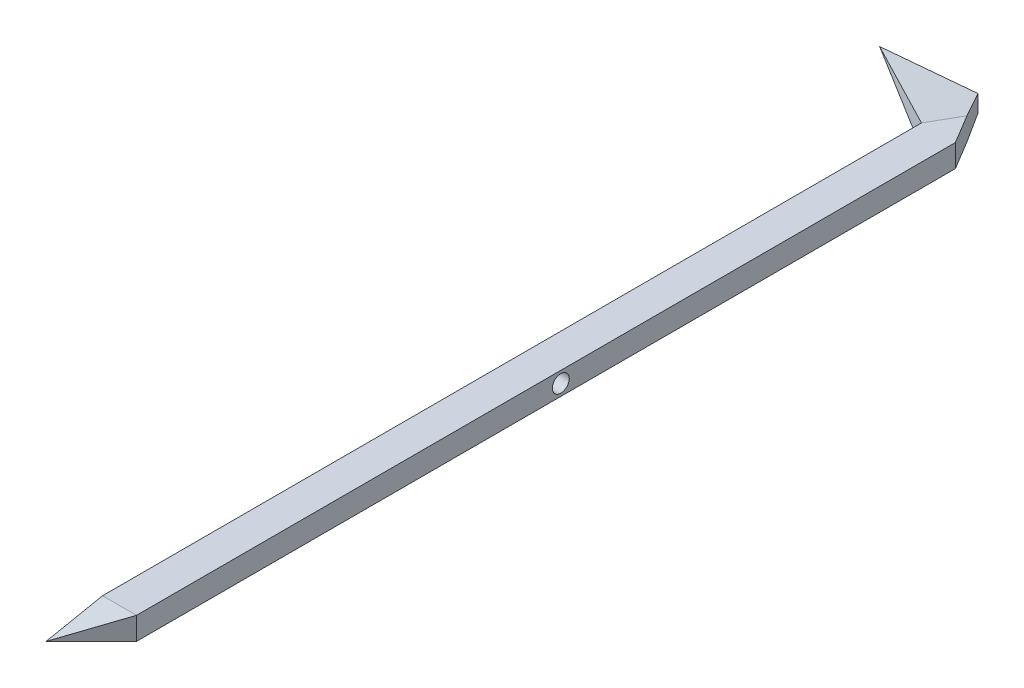
ISO-10303-21;
HEADER;
FILE_DESCRIPTION(('STEP AP214'),'2;1');
FILE_NAME('part.step','',(''),(''),'','','');
FILE_SCHEMA(('AUTOMOTIVE_DESIGN { 1 0 10303 214 1 1 1 1 }'));
ENDSEC;
DATA;
#1=APPLICATION_CONTEXT('core data for automotive mechanical design processes');
#2=APPLICATION_PROTOCOL_DEFINITION('international standard','automotive_design',2000,#1);
#3=PRODUCT_CONTEXT('',#1,'mechanical');
#4=PRODUCT('Part','Part','',(#3));
#5=PRODUCT_RELATED_PRODUCT_CATEGORY('part','',(#4));
#6=PRODUCT_DEFINITION_FORMATION('','',#4);
#7=PRODUCT_DEFINITION_CONTEXT('part definition',#1,'design');
#8=PRODUCT_DEFINITION('design','',#6,#7);
#9=PRODUCT_DEFINITION_SHAPE('','',#8);
#10=(LENGTH_UNIT() NAMED_UNIT(*) SI_UNIT(.MILLI.,.METRE.));
#11=(NAMED_UNIT(*) PLANE_ANGLE_UNIT() SI_UNIT($,.RADIAN.));
#12=(NAMED_UNIT(*) SI_UNIT($,.STERADIAN.) SOLID_ANGLE_UNIT());
#13=UNCERTAINTY_MEASURE_WITH_UNIT(LENGTH_MEASURE(1.E-05),#10,'distance_accuracy_value','');
#14=(GEOMETRIC_REPRESENTATION_CONTEXT(3) GLOBAL_UNCERTAINTY_ASSIGNED_CONTEXT((#13)) GLOBAL_UNIT_ASSIGNED_CONTEXT((#10,
#11,#12)) REPRESENTATION_CONTEXT('',''));
#15=CARTESIAN_POINT('',(0.,0.,0.));
#16=DIRECTION('',(0.,0.,1.));
#17=DIRECTION('',(1.,0.,0.));
#18=AXIS2_PLACEMENT_3D('',#15,#16,#17);
#19=CARTESIAN_POINT('',(46.1850441176472,5.08,-27.7110264705885));
#20=DIRECTION('',(-0.857492925712542,0.,0.514495755427529));
#21=DIRECTION('',(0.51449575542753,0.,0.857492925712543));
#22=AXIS2_PLACEMENT_3D('',#19,#20,#21);
#23=PLANE('',#22);
#24=DIRECTION('',(0.512558070553615,-0.0867074433253538,0.854263450922686));
#25=VECTOR('',#24,1.);
#26=CARTESIAN_POINT('',(45.6400758618361,-7.09010453384916,-28.6193068969404));
#27=LINE('',#26,#25);
#28=CARTESIAN_POINT('',(0.,0.630648525176283,-104.6861));
#29=VERTEX_POINT('',#28);
#30=CARTESIAN_POINT('',(3.72798434442267,0.,-98.4727927592955));
#31=VERTEX_POINT('',#30);
#32=EDGE_CURVE('E134',#29,#31,#27,.T.);
#33=ORIENTED_EDGE('',*,*,#32,.F.);
#34=DIRECTION('',(0.,-1.,0.));
#35=VECTOR('',#34,1.);
#36=CARTESIAN_POINT('',(0.,5.08,-104.6861));
#37=LINE('',#36,#35);
#38=CARTESIAN_POINT('',(0.,4.44935147482372,-104.6861));
#39=VERTEX_POINT('',#38);
#40=EDGE_CURVE('E194',#39,#29,#37,.T.);
#41=ORIENTED_EDGE('',*,*,#40,.F.);
#42=DIRECTION('',(-0.512558070553615,-0.0867074433253538,-0.854263450922686));
#43=VECTOR('',#42,1.);
#44=CARTESIAN_POINT('',(45.8658442690918,12.2082968919475,-28.2430262181809));
#45=LINE('',#44,#43);
#46=CARTESIAN_POINT('',(3.72798434442267,5.08,-98.4727927592955));
#47=VERTEX_POINT('',#46);
#48=EDGE_CURVE('E202',#47,#39,#45,.T.);
#49=ORIENTED_EDGE('',*,*,#48,.F.);
#50=DIRECTION('',(-0.514495755427529,0.,-0.857492925712542));
#51=VECTOR('',#50,1.);
#52=CARTESIAN_POINT('',(46.1850441176472,5.08,-27.7110264705885));
#53=LINE('',#52,#51);
#54=CARTESIAN_POINT('',(7.62000000000002,5.08,-91.9861));
#55=VERTEX_POINT('',#54);
#56=EDGE_CURVE('E239',#55,#47,#53,.T.);
#57=ORIENTED_EDGE('',*,*,#56,.F.);
#58=DIRECTION('',(0.,-1.,0.));
#59=VECTOR('',#58,1.);
#60=CARTESIAN_POINT('',(7.62000000000002,5.08,-91.9861));
#61=LINE('',#60,#59);
#62=CARTESIAN_POINT('',(7.62000000000002,0.,-91.9861));
#63=VERTEX_POINT('',#62);
#64=EDGE_CURVE('E261',#55,#63,#61,.T.);
#65=ORIENTED_EDGE('',*,*,#64,.T.);
#66=DIRECTION('',(-0.514495755427529,0.,-0.857492925712542));
#67=VECTOR('',#66,1.);
#68=CARTESIAN_POINT('',(46.1850441176472,0.,-27.7110264705885));
#69=LINE('',#68,#67);
#70=EDGE_CURVE('E249',#63,#31,#69,.T.);
#71=ORIENTED_EDGE('',*,*,#70,.T.);
#72=EDGE_LOOP('',(#33,#41,#49,#57,#65,#71));
#73=FACE_BOUND('',#72,.T.);
#74=ADVANCED_FACE('F119',(#73),#23,.F.);
#75=CARTESIAN_POINT('',(0.,5.08,-104.6861));
#76=DIRECTION('',(0.,0.,1.));
#77=DIRECTION('',(1.,0.,0.));
#78=AXIS2_PLACEMENT_3D('',#75,#76,#77);
#79=PLANE('',#78);
#80=DIRECTION('',(0.996287962103121,-0.0860830794547339,0.));
#81=VECTOR('',#80,1.);
#82=CARTESIAN_POINT('',(-0.38159211450458,0.663619539141816,-104.6861));
#83=LINE('',#82,#81);
#84=CARTESIAN_POINT('',(-22.098,2.54,-104.6861));
#85=VERTEX_POINT('',#84);
#86=EDGE_CURVE('E179',#85,#29,#83,.T.);
#87=ORIENTED_EDGE('',*,*,#86,.F.);
#88=DIRECTION('',(-0.996287962103121,-0.0860830794547339,0.));
#89=VECTOR('',#88,1.);
#90=CARTESIAN_POINT('',(0.0540866473671303,4.45402476742571,-104.6861));
#91=LINE('',#90,#89);
#92=EDGE_CURVE('E192',#39,#85,#91,.T.);
#93=ORIENTED_EDGE('',*,*,#92,.F.);
#94=ORIENTED_EDGE('',*,*,#40,.T.);
#95=EDGE_LOOP('',(#87,#93,#94));
#96=FACE_BOUND('',#95,.T.);
#97=ADVANCED_FACE('F191',(#96),#79,.F.);
#98=CARTESIAN_POINT('',(39.7397492303108,5.08,-69.1471636607409));
#99=DIRECTION('',(0.498283875853458,0.,-0.867013943985018));
#100=DIRECTION('',(-0.867013943985018,0.,-0.498283875853458));
#101=AXIS2_PLACEMENT_3D('',#98,#99,#100);
#102=PLANE('',#101);
#103=DIRECTION('',(-0.862740387088617,0.0991655617343237,-0.495827808671618));
#104=VECTOR('',#103,1.);
#105=CARTESIAN_POINT('',(38.9143411348215,-4.47291277411741,-69.621536129413));
#106=LINE('',#105,#104);
#107=CARTESIAN_POINT('',(0.,0.,-91.9861));
#108=VERTEX_POINT('',#107);
#109=EDGE_CURVE('E176',#108,#85,#106,.T.);
#110=ORIENTED_EDGE('',*,*,#109,.F.);
#111=DIRECTION('',(0.,-1.,0.));
#112=VECTOR('',#111,1.);
#113=CARTESIAN_POINT('',(0.,5.08,-91.9861));
#114=LINE('',#113,#112);
#115=CARTESIAN_POINT('',(0.,5.08,-91.9861));
#116=VERTEX_POINT('',#115);
#117=EDGE_CURVE('E206',#116,#108,#114,.T.);
#118=ORIENTED_EDGE('',*,*,#117,.F.);
#119=DIRECTION('',(0.862740387088617,0.0991655617343237,0.495827808671618));
#120=VECTOR('',#119,1.);
#121=CARTESIAN_POINT('',(39.3489561412135,9.60286852197856,-69.3717573901072));
#122=LINE('',#121,#120);
#123=EDGE_CURVE('E199',#85,#116,#122,.T.);
#124=ORIENTED_EDGE('',*,*,#123,.F.);
#125=EDGE_LOOP('',(#110,#118,#124));
#126=FACE_BOUND('',#125,.T.);
#127=ADVANCED_FACE('F205',(#126),#102,.F.);
#128=CARTESIAN_POINT('',(0.,0.,0.));
#129=DIRECTION('',(0.,1.,0.));
#130=DIRECTION('',(0.,0.,1.));
#131=AXIS2_PLACEMENT_3D('',#128,#129,#130);
#132=PLANE('',#131);
#133=DIRECTION('',(-0.498283875853458,0.,0.867013943985018));
#134=VECTOR('',#133,1.);
#135=CARTESIAN_POINT('',(-39.7397492303108,0.,-22.8389363392591));
#136=LINE('',#135,#134);
#137=EDGE_CURVE('E12',#31,#108,#136,.T.);
#138=ORIENTED_EDGE('',*,*,#137,.F.);
#139=ORIENTED_EDGE('',*,*,#70,.F.);
#140=DIRECTION('',(0.,0.,-1.));
#141=VECTOR('',#140,1.);
#142=CARTESIAN_POINT('',(7.62000000000002,0.,0.));
#143=LINE('',#142,#141);
#144=CARTESIAN_POINT('',(7.62000600000002,0.,91.9861));
#145=VERTEX_POINT('',#144);
#146=EDGE_CURVE('E238',#145,#63,#143,.T.);
#147=ORIENTED_EDGE('',*,*,#146,.F.);
#148=DIRECTION('',(1.,0.,0.));
#149=VECTOR('',#148,1.);
#150=CARTESIAN_POINT('',(-22.098,0.,91.9861));
#151=LINE('',#150,#149);
#152=CARTESIAN_POINT('',(0.,0.,91.9861));
#153=VERTEX_POINT('',#152);
#154=EDGE_CURVE('E215',#153,#145,#151,.T.);
#155=ORIENTED_EDGE('',*,*,#154,.F.);
#156=DIRECTION('',(0.,0.,1.));
#157=VECTOR('',#156,1.);
#158=CARTESIAN_POINT('',(0.,0.,0.));
#159=LINE('',#158,#157);
#160=EDGE_CURVE('E253',#108,#153,#159,.T.);
#161=ORIENTED_EDGE('',*,*,#160,.F.);
#162=EDGE_LOOP('',(#138,#139,#147,#155,#161));
#163=FACE_BOUND('',#162,.T.);
#164=ADVANCED_FACE('F292',(#163),#132,.F.);
#165=CARTESIAN_POINT('',(0.,5.08,0.));
#166=DIRECTION('',(0.,1.,0.));
#167=DIRECTION('',(0.,0.,1.));
#168=AXIS2_PLACEMENT_3D('',#165,#166,#167);
#169=PLANE('',#168);
#170=ORIENTED_EDGE('',*,*,#56,.T.);
#171=DIRECTION('',(-0.498283875853458,0.,0.867013943985018));
#172=VECTOR('',#171,1.);
#173=CARTESIAN_POINT('',(-39.7397492303108,5.08,-22.8389363392591));
#174=LINE('',#173,#172);
#175=EDGE_CURVE('E128',#47,#116,#174,.T.);
#176=ORIENTED_EDGE('',*,*,#175,.T.);
#177=DIRECTION('',(0.,0.,1.));
#178=VECTOR('',#177,1.);
#179=CARTESIAN_POINT('',(0.,5.08,0.));
#180=LINE('',#179,#178);
#181=CARTESIAN_POINT('',(0.,5.08,91.9861));
#182=VERTEX_POINT('',#181);
#183=EDGE_CURVE('E243',#116,#182,#180,.T.);
#184=ORIENTED_EDGE('',*,*,#183,.T.);
#185=DIRECTION('',(-1.,0.,0.));
#186=VECTOR('',#185,1.);
#187=CARTESIAN_POINT('',(0.,5.08,91.9861));
#188=LINE('',#187,#186);
#189=CARTESIAN_POINT('',(7.62000000000002,5.08,91.9861));
#190=VERTEX_POINT('',#189);
#191=EDGE_CURVE('E265',#190,#182,#188,.T.);
#192=ORIENTED_EDGE('',*,*,#191,.F.);
#193=DIRECTION('',(0.,0.,-1.));
#194=VECTOR('',#193,1.);
#195=CARTESIAN_POINT('',(7.62000000000002,5.08,0.));
#196=LINE('',#195,#194);
#197=EDGE_CURVE('E244',#190,#55,#196,.T.);
#198=ORIENTED_EDGE('',*,*,#197,.T.);
#199=EDGE_LOOP('',(#170,#176,#184,#192,#198));
#200=FACE_BOUND('',#199,.T.);
#201=ADVANCED_FACE('F286',(#200),#169,.T.);
#202=CARTESIAN_POINT('',(7.62000000000002,5.08,0.));
#203=DIRECTION('',(-1.,0.,0.));
#204=DIRECTION('',(0.,0.,1.));
#205=AXIS2_PLACEMENT_3D('',#202,#203,#204);
#206=PLANE('',#205);
#207=CARTESIAN_POINT('',(7.62000000000002,2.54,-3.3401));
#208=DIRECTION('',(-1.,0.,0.));
#209=DIRECTION('',(0.,0.,1.));
#210=AXIS2_PLACEMENT_3D('',#207,#208,#209);
#211=CIRCLE('',#210,1.905);
#212=CARTESIAN_POINT('',(7.62000000000002,2.54,-1.4351));
#213=VERTEX_POINT('',#212);
#214=EDGE_CURVE('E185',#213,#213,#211,.T.);
#215=ORIENTED_EDGE('',*,*,#214,.T.);
#216=EDGE_LOOP('',(#215));
#217=FACE_BOUND('',#216,.T.);
#218=ORIENTED_EDGE('',*,*,#146,.T.);
#219=ORIENTED_EDGE('',*,*,#64,.F.);
#220=ORIENTED_EDGE('',*,*,#197,.F.);
#221=DIRECTION('',(0.,-1.,0.));
#222=VECTOR('',#221,1.);
#223=CARTESIAN_POINT('',(7.62000000000002,5.08,91.9861));
#224=LINE('',#223,#222);
#225=EDGE_CURVE('E248',#190,#145,#224,.T.);
#226=ORIENTED_EDGE('',*,*,#225,.T.);
#227=EDGE_LOOP('',(#218,#219,#220,#226));
#228=FACE_BOUND('',#227,.T.);
#229=ADVANCED_FACE('F121',(#217,#228),#206,.F.);
#230=CARTESIAN_POINT('',(0.,5.08,0.));
#231=DIRECTION('',(1.,0.,0.));
#232=DIRECTION('',(0.,0.,-1.));
#233=AXIS2_PLACEMENT_3D('',#230,#231,#232);
#234=PLANE('',#233);
#235=CARTESIAN_POINT('',(0.,2.54,-3.3401));
#236=DIRECTION('',(-1.,0.,0.));
#237=DIRECTION('',(0.,0.,1.));
#238=AXIS2_PLACEMENT_3D('',#235,#236,#237);
#239=CIRCLE('',#238,1.905);
#240=CARTESIAN_POINT('',(0.,2.54,-1.4351));
#241=VERTEX_POINT('',#240);
#242=EDGE_CURVE('E343',#241,#241,#239,.T.);
#243=ORIENTED_EDGE('',*,*,#242,.F.);
#244=EDGE_LOOP('',(#243));
#245=FACE_BOUND('',#244,.T.);
#246=ORIENTED_EDGE('',*,*,#160,.T.);
#247=DIRECTION('',(0.,0.196116135138184,0.98058067569092));
#248=VECTOR('',#247,1.);
#249=CARTESIAN_POINT('',(0.,-17.49425,4.51485000000001));
#250=LINE('',#249,#248);
#251=CARTESIAN_POINT('',(0.,2.54,104.6861));
#252=VERTEX_POINT('',#251);
#253=EDGE_CURVE('E142',#153,#252,#250,.T.);
#254=ORIENTED_EDGE('',*,*,#253,.T.);
#255=DIRECTION('',(0.,0.196116135138184,-0.98058067569092));
#256=VECTOR('',#255,1.);
#257=CARTESIAN_POINT('',(0.,22.7696346153846,3.53792692307693));
#258=LINE('',#257,#256);
#259=EDGE_CURVE('E232',#252,#182,#258,.T.);
#260=ORIENTED_EDGE('',*,*,#259,.T.);
#261=ORIENTED_EDGE('',*,*,#183,.F.);
#262=ORIENTED_EDGE('',*,*,#117,.T.);
#263=EDGE_LOOP('',(#246,#254,#260,#261,#262));
#264=FACE_BOUND('',#263,.T.);
#265=ADVANCED_FACE('F295',(#245,#264),#234,.F.);
#266=CARTESIAN_POINT('',(46.1850441176471,5.08,27.7110264705882));
#267=DIRECTION('',(-0.857492925712544,0.,-0.514495755427526));
#268=DIRECTION('',(-0.514495755427526,0.,0.857492925712544));
#269=AXIS2_PLACEMENT_3D('',#266,#267,#268);
#270=PLANE('',#269);
#271=DIRECTION('',(-0.50709255283711,-0.169030850945703,0.845154254728517));
#272=VECTOR('',#271,1.);
#273=CARTESIAN_POINT('',(45.0831857142857,17.5677285714286,29.5474571428571));
#274=LINE('',#273,#272);
#275=EDGE_CURVE('E228',#190,#252,#274,.T.);
#276=ORIENTED_EDGE('',*,*,#275,.T.);
#277=DIRECTION('',(0.50709255283711,-0.169030850945703,-0.845154254728517));
#278=VECTOR('',#277,1.);
#279=CARTESIAN_POINT('',(44.6477571428571,-12.3425857142857,30.2731714285714));
#280=LINE('',#279,#278);
#281=EDGE_CURVE('E220',#252,#145,#280,.T.);
#282=ORIENTED_EDGE('',*,*,#281,.T.);
#283=ORIENTED_EDGE('',*,*,#225,.F.);
#284=EDGE_LOOP('',(#276,#282,#283));
#285=FACE_BOUND('',#284,.T.);
#286=ADVANCED_FACE('F301',(#285),#270,.F.);
#287=CARTESIAN_POINT('',(7.62001200000002,22.57425,4.51485000000001));
#288=DIRECTION('',(0.,-0.98058067569092,-0.196116135138184));
#289=DIRECTION('',(0.,0.196116135138184,-0.98058067569092));
#290=AXIS2_PLACEMENT_3D('',#287,#288,#289);
#291=PLANE('',#290);
#292=ORIENTED_EDGE('',*,*,#275,.F.);
#293=ORIENTED_EDGE('',*,*,#191,.T.);
#294=ORIENTED_EDGE('',*,*,#259,.F.);
#295=EDGE_LOOP('',(#292,#293,#294));
#296=FACE_BOUND('',#295,.T.);
#297=ADVANCED_FACE('F298',(#296),#291,.F.);
#298=CARTESIAN_POINT('',(7.62001200000002,-17.6896346153846,3.53792692307693));
#299=DIRECTION('',(0.,0.98058067569092,-0.196116135138184));
#300=DIRECTION('',(0.,0.196116135138184,0.98058067569092));
#301=AXIS2_PLACEMENT_3D('',#298,#299,#300);
#302=PLANE('',#301);
#303=ORIENTED_EDGE('',*,*,#154,.T.);
#304=ORIENTED_EDGE('',*,*,#281,.F.);
#305=ORIENTED_EDGE('',*,*,#253,.F.);
#306=EDGE_LOOP('',(#303,#304,#305));
#307=FACE_BOUND('',#306,.T.);
#308=ADVANCED_FACE('F330',(#307),#302,.F.);
#309=CARTESIAN_POINT('',(46.2929440248801,9.55291277411741,-82.460305158115));
#310=DIRECTION('',(-0.0859779247867658,0.995070947905684,-0.0494126004521642));
#311=DIRECTION('',(-0.996287962103121,-0.0860830794547339,0.));
#312=AXIS2_PLACEMENT_3D('',#309,#310,#311);
#313=PLANE('',#312);
#314=ORIENTED_EDGE('',*,*,#48,.T.);
#315=ORIENTED_EDGE('',*,*,#92,.T.);
#316=ORIENTED_EDGE('',*,*,#123,.T.);
#317=ORIENTED_EDGE('',*,*,#175,.F.);
#318=EDGE_LOOP('',(#314,#315,#316,#317));
#319=FACE_BOUND('',#318,.T.);
#320=ADVANCED_FACE('F198',(#319),#313,.T.);
#321=CARTESIAN_POINT('',(46.7275590312721,-4.52286852197856,-82.2105264188092));
#322=DIRECTION('',(-0.0859779247867658,-0.995070947905684,-0.0494126004521642));
#323=DIRECTION('',(0.996287962103121,-0.0860830794547339,0.));
#324=AXIS2_PLACEMENT_3D('',#321,#322,#323);
#325=PLANE('',#324);
#326=ORIENTED_EDGE('',*,*,#32,.T.);
#327=ORIENTED_EDGE('',*,*,#137,.T.);
#328=ORIENTED_EDGE('',*,*,#109,.T.);
#329=ORIENTED_EDGE('',*,*,#86,.T.);
#330=EDGE_LOOP('',(#326,#327,#328,#329));
#331=FACE_BOUND('',#330,.T.);
#332=ADVANCED_FACE('F178',(#331),#325,.T.);
#333=CARTESIAN_POINT('',(21.336,2.54,-3.3401));
#334=DIRECTION('',(-1.,0.,0.));
#335=DIRECTION('',(0.,0.,1.));
#336=AXIS2_PLACEMENT_3D('',#333,#334,#335);
#337=CYLINDRICAL_SURFACE('',#336,1.905);
#338=CARTESIAN_POINT('',(0.,2.54,-1.4351));
#339=CARTESIAN_POINT('',(0.0793750000000007,2.54,-1.4351));
#340=CARTESIAN_POINT('',(0.158750000000002,2.54,-1.4351));
#341=CARTESIAN_POINT('',(0.317500000000002,2.54,-1.4351));
#342=CARTESIAN_POINT('',(0.396875000000001,2.54,-1.4351));
#343=CARTESIAN_POINT('',(0.555625000000002,2.54,-1.4351));
#344=CARTESIAN_POINT('',(0.635000000000002,2.54,-1.4351));
#345=CARTESIAN_POINT('',(0.793750000000003,2.54,-1.4351));
#346=CARTESIAN_POINT('',(0.873125000000002,2.54,-1.4351));
#347=CARTESIAN_POINT('',(1.031875,2.54,-1.4351));
#348=CARTESIAN_POINT('',(1.11125,2.54,-1.4351));
#349=CARTESIAN_POINT('',(1.27,2.54,-1.4351));
#350=CARTESIAN_POINT('',(1.34937500000001,2.54,-1.4351));
#351=CARTESIAN_POINT('',(1.50812500000001,2.54,-1.4351));
#352=CARTESIAN_POINT('',(1.58750000000001,2.54,-1.4351));
#353=CARTESIAN_POINT('',(1.74625000000001,2.54,-1.4351));
#354=CARTESIAN_POINT('',(1.82562500000001,2.54,-1.4351));
#355=CARTESIAN_POINT('',(1.98437500000001,2.54,-1.4351));
#356=CARTESIAN_POINT('',(2.06375000000001,2.54,-1.4351));
#357=CARTESIAN_POINT('',(2.22250000000001,2.54,-1.4351));
#358=CARTESIAN_POINT('',(2.30187500000001,2.54,-1.4351));
#359=CARTESIAN_POINT('',(2.46062500000001,2.54,-1.4351));
#360=CARTESIAN_POINT('',(2.54000000000001,2.54,-1.4351));
#361=CARTESIAN_POINT('',(2.69875000000001,2.54,-1.4351));
#362=CARTESIAN_POINT('',(2.77812500000001,2.54,-1.4351));
#363=CARTESIAN_POINT('',(2.93687500000001,2.54,-1.4351));
#364=CARTESIAN_POINT('',(3.01625000000001,2.54,-1.4351));
#365=CARTESIAN_POINT('',(3.17500000000001,2.54,-1.4351));
#366=CARTESIAN_POINT('',(3.25437500000001,2.54,-1.4351));
#367=CARTESIAN_POINT('',(3.41312500000001,2.54,-1.4351));
#368=CARTESIAN_POINT('',(3.49250000000001,2.54,-1.4351));
#369=CARTESIAN_POINT('',(3.65125000000001,2.54,-1.4351));
#370=CARTESIAN_POINT('',(3.73062500000001,2.54,-1.4351));
#371=CARTESIAN_POINT('',(3.88937500000001,2.54,-1.4351));
#372=CARTESIAN_POINT('',(3.96875000000001,2.54,-1.4351));
#373=CARTESIAN_POINT('',(4.12750000000001,2.54,-1.4351));
#374=CARTESIAN_POINT('',(4.20687500000002,2.54,-1.4351));
#375=CARTESIAN_POINT('',(4.36562500000002,2.54,-1.4351));
#376=CARTESIAN_POINT('',(4.44500000000001,2.54,-1.4351));
#377=CARTESIAN_POINT('',(4.60375000000001,2.54,-1.4351));
#378=CARTESIAN_POINT('',(4.68312500000002,2.54,-1.4351));
#379=CARTESIAN_POINT('',(4.84187500000002,2.54,-1.4351));
#380=CARTESIAN_POINT('',(4.92125000000002,2.54,-1.4351));
#381=CARTESIAN_POINT('',(5.08000000000002,2.54,-1.4351));
#382=CARTESIAN_POINT('',(5.15937500000002,2.54,-1.4351));
#383=CARTESIAN_POINT('',(5.31812500000002,2.54,-1.4351));
#384=CARTESIAN_POINT('',(5.39750000000002,2.54,-1.4351));
#385=CARTESIAN_POINT('',(5.55625000000002,2.54,-1.4351));
#386=CARTESIAN_POINT('',(5.63562500000002,2.54,-1.4351));
#387=CARTESIAN_POINT('',(5.79437500000002,2.54,-1.4351));
#388=CARTESIAN_POINT('',(5.87375000000002,2.54,-1.4351));
#389=CARTESIAN_POINT('',(6.03250000000002,2.54,-1.4351));
#390=CARTESIAN_POINT('',(6.11187500000002,2.54,-1.4351));
#391=CARTESIAN_POINT('',(6.27062500000002,2.54,-1.4351));
#392=CARTESIAN_POINT('',(6.35000000000002,2.54,-1.4351));
#393=CARTESIAN_POINT('',(6.50875000000002,2.54,-1.4351));
#394=CARTESIAN_POINT('',(6.58812500000002,2.54,-1.4351));
#395=CARTESIAN_POINT('',(6.74687500000002,2.54,-1.4351));
#396=CARTESIAN_POINT('',(6.82625000000002,2.54,-1.4351));
#397=CARTESIAN_POINT('',(6.98500000000002,2.54,-1.4351));
#398=CARTESIAN_POINT('',(7.06437500000002,2.54,-1.4351));
#399=CARTESIAN_POINT('',(7.22312500000002,2.54,-1.4351));
#400=CARTESIAN_POINT('',(7.30250000000002,2.54,-1.4351));
#401=CARTESIAN_POINT('',(7.46125000000002,2.54,-1.4351));
#402=CARTESIAN_POINT('',(7.54062500000002,2.54,-1.4351));
#403=CARTESIAN_POINT('',(7.62000000000002,2.54,-1.4351));
#404=B_SPLINE_CURVE_WITH_KNOTS('',3,(#338,#339,#340,#341,#342,#343,#344,#345,#346,#347,#348,
#349,#350,#351,#352,#353,#354,#355,#356,#357,#358,#359,#360,#361,#362,#363,#364,#365,#366,#367,
#368,#369,#370,#371,#372,#373,#374,#375,#376,#377,#378,#379,#380,#381,#382,#383,#384,#385,#386,
#387,#388,#389,#390,#391,#392,#393,#394,#395,#396,#397,#398,#399,#400,#401,#402,#403),
.UNSPECIFIED.,.F.,.F.,(4,2,2,2,2,2,2,2,2,2,2,2,2,2,2,2,2,2,2,2,2,2,2,2,2,2,2,2,2,2,2,2,4),(0.,
0.238125000000002,0.476250000000001,0.714375000000003,0.952500000000002,1.190625,
1.42875000000001,1.66687500000001,1.90500000000001,2.14312500000001,2.38125000000001,
2.61937500000001,2.85750000000001,3.09562500000001,3.33375000000001,3.57187500000001,
3.81000000000001,4.04812500000001,4.28625000000002,4.52437500000001,4.76250000000002,
5.00062500000002,5.23875000000002,5.47687500000002,5.71500000000002,5.95312500000002,
6.19125000000002,6.42937500000002,6.66750000000002,6.90562500000002,7.14375000000002,
7.38187500000002,7.62000000000002),.UNSPECIFIED.);
#405=EDGE_CURVE('BSEAM335',#241,#213,#404,.T.);
#406=ORIENTED_EDGE('',*,*,#242,.T.);
#407=ORIENTED_EDGE('',*,*,#214,.F.);
#408=ORIENTED_EDGE('',*,*,#405,.T.);
#409=ORIENTED_EDGE('',*,*,#405,.F.);
#410=EDGE_LOOP('',(#406,#408,#407,#409));
#411=FACE_BOUND('',#410,.T.);
#412=ADVANCED_FACE('F335',(#411),#337,.F.);
#413=CLOSED_SHELL('',(#74,#97,#127,#164,#201,#229,#265,#286,#297,#308,#320,#332,#412));
#414=MANIFOLD_SOLID_BREP('B2',#413);
#415=ADVANCED_BREP_SHAPE_REPRESENTATION('',(#18,#414),#14);
#416=SHAPE_DEFINITION_REPRESENTATION(#9,#415);
ENDSEC;
END-ISO-10303-21;
